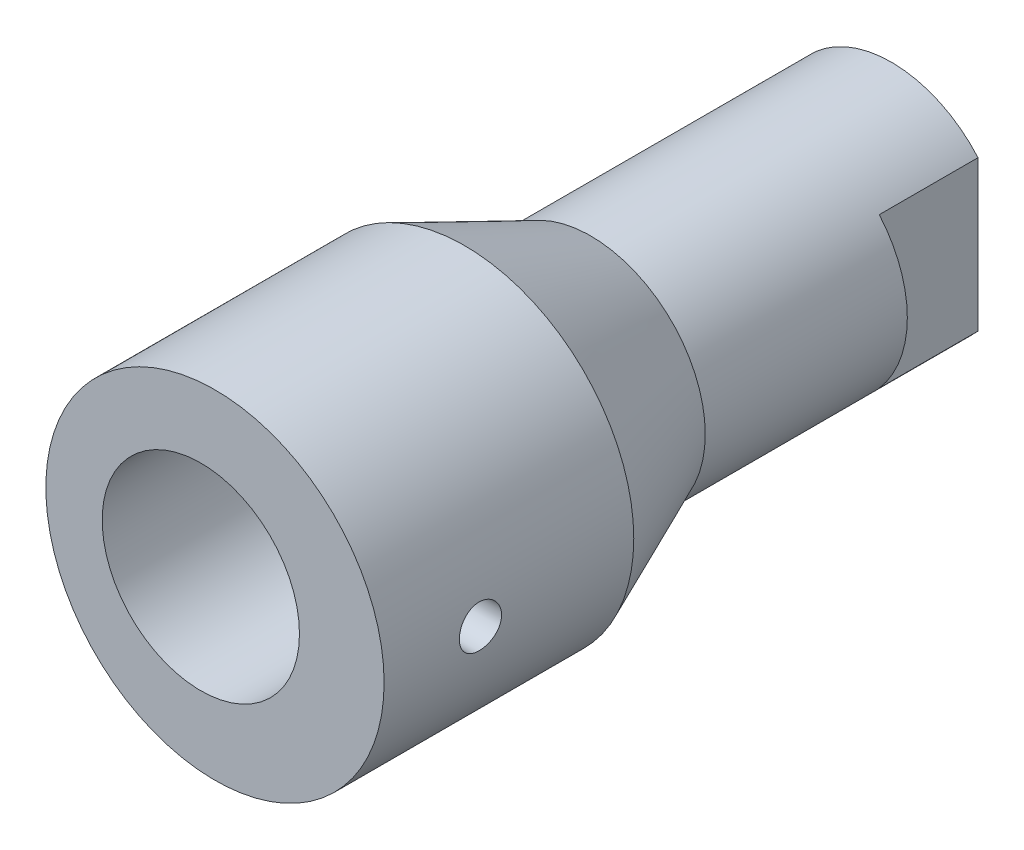
ISO-10303-21;
HEADER;
FILE_DESCRIPTION(('STEP AP214'),'2;1');
FILE_NAME('part.step','',(''),(''),'','','');
FILE_SCHEMA(('AUTOMOTIVE_DESIGN { 1 0 10303 214 1 1 1 1 }'));
ENDSEC;
DATA;
#1=APPLICATION_CONTEXT('core data for automotive mechanical design processes');
#2=APPLICATION_PROTOCOL_DEFINITION('international standard','automotive_design',2000,#1);
#3=PRODUCT_CONTEXT('',#1,'mechanical');
#4=PRODUCT('Part','Part','',(#3));
#5=PRODUCT_RELATED_PRODUCT_CATEGORY('part','',(#4));
#6=PRODUCT_DEFINITION_FORMATION('','',#4);
#7=PRODUCT_DEFINITION_CONTEXT('part definition',#1,'design');
#8=PRODUCT_DEFINITION('design','',#6,#7);
#9=PRODUCT_DEFINITION_SHAPE('','',#8);
#10=(LENGTH_UNIT() NAMED_UNIT(*) SI_UNIT(.MILLI.,.METRE.));
#11=(NAMED_UNIT(*) PLANE_ANGLE_UNIT() SI_UNIT($,.RADIAN.));
#12=(NAMED_UNIT(*) SI_UNIT($,.STERADIAN.) SOLID_ANGLE_UNIT());
#13=UNCERTAINTY_MEASURE_WITH_UNIT(LENGTH_MEASURE(1.E-05),#10,'distance_accuracy_value','');
#14=(GEOMETRIC_REPRESENTATION_CONTEXT(3) GLOBAL_UNCERTAINTY_ASSIGNED_CONTEXT((#13)) GLOBAL_UNIT_ASSIGNED_CONTEXT((#10,
#11,#12)) REPRESENTATION_CONTEXT('',''));
#15=CARTESIAN_POINT('',(0.,0.,0.));
#16=DIRECTION('',(0.,0.,1.));
#17=DIRECTION('',(1.,0.,0.));
#18=AXIS2_PLACEMENT_3D('',#15,#16,#17);
#19=CARTESIAN_POINT('',(0.,0.,16.3461290322581));
#20=DIRECTION('',(0.,0.,1.));
#21=DIRECTION('',(1.,0.,0.));
#22=AXIS2_PLACEMENT_3D('',#19,#20,#21);
#23=CYLINDRICAL_SURFACE('',#22,9.525);
#24=CARTESIAN_POINT('',(0.,0.,16.3461290322581));
#25=DIRECTION('',(0.,0.,1.));
#26=DIRECTION('',(1.,0.,0.));
#27=AXIS2_PLACEMENT_3D('',#24,#25,#26);
#28=CIRCLE('',#27,9.525);
#29=CARTESIAN_POINT('',(9.525,0.,16.3461290322581));
#30=VERTEX_POINT('',#29);
#31=EDGE_CURVE('E105',#30,#30,#28,.T.);
#32=ORIENTED_EDGE('',*,*,#31,.F.);
#33=EDGE_LOOP('',(#32));
#34=FACE_BOUND('',#33,.T.);
#35=CARTESIAN_POINT('',(0.,0.,2.28612903225807));
#36=DIRECTION('',(0.,0.,1.));
#37=DIRECTION('',(1.,0.,0.));
#38=AXIS2_PLACEMENT_3D('',#35,#36,#37);
#39=CIRCLE('',#38,9.525);
#40=CARTESIAN_POINT('',(9.525,0.,2.28612903225807));
#41=VERTEX_POINT('',#40);
#42=EDGE_CURVE('E97',#41,#41,#39,.T.);
#43=ORIENTED_EDGE('',*,*,#42,.T.);
#44=EDGE_LOOP('',(#43));
#45=FACE_BOUND('',#44,.T.);
#46=CARTESIAN_POINT('',(9.525,0.,9.72803795830738));
#47=CARTESIAN_POINT('',(9.52499907170145,0.0665646520037431,9.72804078638131));
#48=CARTESIAN_POINT('',(9.52429485853708,0.133170905648445,9.73364189763921));
#49=CARTESIAN_POINT('',(9.52155335064732,0.264530009211301,9.75589742294277));
#50=CARTESIAN_POINT('',(9.5195146637934,0.329280849845303,9.77256338014122));
#51=CARTESIAN_POINT('',(9.51433387889246,0.455008417360698,9.81644993177726));
#52=CARTESIAN_POINT('',(9.51119252345853,0.515987651873184,9.84366342405887));
#53=CARTESIAN_POINT('',(9.50415578957354,0.632502022652442,9.90785703219819));
#54=CARTESIAN_POINT('',(9.50026054056031,0.688038091007486,9.94483547188485));
#55=CARTESIAN_POINT('',(9.49212697127573,0.792406676952907,10.0277267225323));
#56=CARTESIAN_POINT('',(9.48788706067079,0.841204946929219,10.073682503049));
#57=CARTESIAN_POINT('',(9.47955485668132,0.930417788482917,10.1731316719396));
#58=CARTESIAN_POINT('',(9.47546257082798,0.970831932835929,10.2266254441889));
#59=CARTESIAN_POINT('',(9.46787329340602,1.04225683375581,10.3398546052331));
#60=CARTESIAN_POINT('',(9.4643783500292,1.07323551067544,10.3996103789618));
#61=CARTESIAN_POINT('',(9.4584004228715,1.1247052340692,10.5235271593249));
#62=CARTESIAN_POINT('',(9.4559174007561,1.14519667783775,10.587687998975));
#63=CARTESIAN_POINT('',(9.45225962798759,1.17500620795241,10.7182382293527));
#64=CARTESIAN_POINT('',(9.45107810971302,1.18438211302209,10.7846142249681));
#65=CARTESIAN_POINT('',(9.450136403881,1.19187332796745,10.9180072829718));
#66=CARTESIAN_POINT('',(9.45037615922421,1.18998909021671,10.9850243194983));
#67=CARTESIAN_POINT('',(9.45224371835326,1.1750609694632,11.117394151468));
#68=CARTESIAN_POINT('',(9.45386360029008,1.16208077520942,11.1827542571149));
#69=CARTESIAN_POINT('',(9.45829653544857,1.12542857055956,11.310361226825));
#70=CARTESIAN_POINT('',(9.46110961282181,1.10175634374461,11.372608027843));
#71=CARTESIAN_POINT('',(9.46762095589266,1.04432358022543,11.4924192940394));
#72=CARTESIAN_POINT('',(9.47132164456707,1.01053536538763,11.5499703543678));
#73=CARTESIAN_POINT('',(9.47918935918016,0.933849550190273,11.6586095877829));
#74=CARTESIAN_POINT('',(9.48335640642261,0.890951533604897,11.7096974653972));
#75=CARTESIAN_POINT('',(9.49172252818641,0.796910859530199,11.8043298060407));
#76=CARTESIAN_POINT('',(9.49592162513353,0.745713305587401,11.8478197324498));
#77=CARTESIAN_POINT('',(9.50385178207517,0.636715888465115,11.9255970223842));
#78=CARTESIAN_POINT('',(9.50758284099238,0.578916010089009,11.9598843647272));
#79=CARTESIAN_POINT('',(9.51415884469546,0.458312624526359,12.0182832305622));
#80=CARTESIAN_POINT('',(9.51700349218751,0.395507447460569,12.0423913409985));
#81=CARTESIAN_POINT('',(9.52148345761662,0.266696949285937,12.0797041155535));
#82=CARTESIAN_POINT('',(9.5231188321096,0.200691777989969,12.09290928959));
#83=CARTESIAN_POINT('',(9.5249886368126,0.0678264889648327,12.1079706651379));
#84=CARTESIAN_POINT('',(9.5252323407042,0.000975012917947294,12.1099019941432));
#85=CARTESIAN_POINT('',(9.52431638332426,-0.132098660203066,12.1025591162331));
#86=CARTESIAN_POINT('',(9.52315675190681,-0.198320870633774,12.0932851476955));
#87=CARTESIAN_POINT('',(9.51957020630124,-0.32803454383064,12.0638573391096));
#88=CARTESIAN_POINT('',(9.51714746524507,-0.391534258151819,12.043739318871));
#89=CARTESIAN_POINT('',(9.51130594946059,-0.51425856889069,11.9932317234835));
#90=CARTESIAN_POINT('',(9.50788714094501,-0.573483020203593,11.9628417998992));
#91=CARTESIAN_POINT('',(9.50041153946152,-0.686311172020218,11.8924712771789));
#92=CARTESIAN_POINT('',(9.49635155070484,-0.739884346150236,11.8524420790868));
#93=CARTESIAN_POINT('',(9.48805775592256,-0.839578626205299,11.7639980471728));
#94=CARTESIAN_POINT('',(9.48382394301005,-0.885699436509324,11.7155828808532));
#95=CARTESIAN_POINT('',(9.47563106843556,-0.969446321520713,11.6114103226808));
#96=CARTESIAN_POINT('',(9.47167370611486,-1.00702259779219,11.5556127435138));
#97=CARTESIAN_POINT('',(9.46450973694477,-1.07226973749048,11.438454271705));
#98=CARTESIAN_POINT('',(9.46130311505912,-1.09994079931048,11.3770934905205));
#99=CARTESIAN_POINT('',(9.45601525451816,-1.14451140309528,11.2507111315565));
#100=CARTESIAN_POINT('',(9.45393108416766,-1.161439026368,11.1856995849601));
#101=CARTESIAN_POINT('',(9.45111568721878,-1.18413266957875,11.0537290547347));
#102=CARTESIAN_POINT('',(9.4503843977522,-1.18989920817153,10.9867701617456));
#103=CARTESIAN_POINT('',(9.45035939069785,-1.19009748271758,10.853301089487));
#104=CARTESIAN_POINT('',(9.45105575057478,-1.18460745471799,10.7867910147421));
#105=CARTESIAN_POINT('',(9.45378624695124,-1.16261410620535,10.6556468143641));
#106=CARTESIAN_POINT('',(9.45582038359876,-1.14611078447389,10.5910126889385));
#107=CARTESIAN_POINT('',(9.46099416880242,-1.10258376851857,10.4654653776988));
#108=CARTESIAN_POINT('',(9.46413342179665,-1.07556383821178,10.4045508696392));
#109=CARTESIAN_POINT('',(9.47116437846166,-1.01177830478418,10.2881078973395));
#110=CARTESIAN_POINT('',(9.47505609152141,-0.975012580056269,10.2325795003187));
#111=CARTESIAN_POINT('',(9.48318587427232,-0.89248884651042,10.1280850775325));
#112=CARTESIAN_POINT('',(9.48742607972733,-0.846672532268642,10.0791652610174));
#113=CARTESIAN_POINT('',(9.49575622588527,-0.747469729091237,9.9896782287403));
#114=CARTESIAN_POINT('',(9.49984613092141,-0.694081457725055,9.94911298516487));
#115=CARTESIAN_POINT('',(9.50743200612474,-0.581017694542081,9.87735545046941));
#116=CARTESIAN_POINT('',(9.51092566093731,-0.521319088388247,9.84619935216814));
#117=CARTESIAN_POINT('',(9.51690191028703,-0.397526902560449,9.79439892607394));
#118=CARTESIAN_POINT('',(9.51938560294232,-0.333438185297214,9.77374317524818));
#119=CARTESIAN_POINT('',(9.52246331056611,-0.224181596016582,9.74847455928046));
#120=CARTESIAN_POINT('',(9.52340993512496,-0.179702687213667,9.74082184731768));
#121=CARTESIAN_POINT('',(9.52467859193208,-0.0901555449611947,9.73060260776452));
#122=CARTESIAN_POINT('',(9.52500062877952,-0.0450873158535712,9.72803604272217));
#123=CARTESIAN_POINT('',(9.525,0.,9.72803795830738));
#124=B_SPLINE_CURVE_WITH_KNOTS('',3,(#46,#47,#48,#49,#50,#51,#52,#53,#54,#55,#56,#57,#58,#59,
#60,#61,#62,#63,#64,#65,#66,#67,#68,#69,#70,#71,#72,#73,#74,#75,#76,#77,#78,#79,#80,#81,#82,#83,
#84,#85,#86,#87,#88,#89,#90,#91,#92,#93,#94,#95,#96,#97,#98,#99,#100,#101,#102,#103,#104,#105,
#106,#107,#108,#109,#110,#111,#112,#113,#114,#115,#116,#117,#118,#119,#120,#121,#122,#123),
.UNSPECIFIED.,.T.,.F.,(4,2,2,2,2,2,2,2,2,2,2,2,2,2,2,2,2,2,2,2,2,2,2,2,2,2,2,2,2,2,2,2,2,2,2,2,
2,2,4),(0.,0.199529266287023,0.399267014778791,0.598870503365467,0.798439751894954,
0.998988728802717,1.199547922444,1.40078157549877,1.60200760452837,1.80218227602547,
2.0023489056066,2.20137427117681,2.4004036654268,2.59998267510015,2.79957080547855,
3.00053741906827,3.20150449523365,3.40253890144869,3.60356390498639,3.80324775993076,
4.0029273669426,4.20195140325147,4.40098219137312,4.60103826680341,4.80110227612839,
5.0023039881803,5.20350167010428,5.40417126985321,5.60483154427725,5.80410190618668,
6.00337229014164,6.20257142027768,6.40177303611889,6.60230244941591,6.80287914571096,
7.00421782289996,7.2053369981424,7.34048838893393,7.47563878453141),.UNSPECIFIED.);
#125=CARTESIAN_POINT('',(9.525,0.,9.72803795830738));
#126=VERTEX_POINT('',#125);
#127=EDGE_CURVE('E145',#126,#126,#124,.T.);
#128=ORIENTED_EDGE('',*,*,#127,.F.);
#129=EDGE_LOOP('',(#128));
#130=FACE_BOUND('',#129,.T.);
#131=ADVANCED_FACE('F45',(#34,#45,#130),#23,.T.);
#132=CARTESIAN_POINT('',(-0.796682273705366,0.,2.28612903225807));
#133=DIRECTION('',(0.,0.,1.));
#134=DIRECTION('',(1.,0.,0.));
#135=AXIS2_PLACEMENT_3D('',#132,#133,#134);
#136=CYLINDRICAL_SURFACE('',#135,5.555);
#137=CARTESIAN_POINT('',(-0.796682273705366,0.,2.28612903225807));
#138=DIRECTION('',(0.,0.,1.));
#139=DIRECTION('',(1.,0.,0.));
#140=AXIS2_PLACEMENT_3D('',#137,#138,#139);
#141=CIRCLE('',#140,5.555);
#142=CARTESIAN_POINT('',(4.75831772629463,0.,2.28612903225807));
#143=VERTEX_POINT('',#142);
#144=EDGE_CURVE('E87',#143,#143,#141,.T.);
#145=ORIENTED_EDGE('',*,*,#144,.F.);
#146=EDGE_LOOP('',(#145));
#147=FACE_BOUND('',#146,.T.);
#148=CARTESIAN_POINT('',(-0.796682273705366,0.,16.3461290322581));
#149=DIRECTION('',(0.,0.,1.));
#150=DIRECTION('',(1.,0.,0.));
#151=AXIS2_PLACEMENT_3D('',#148,#149,#150);
#152=CIRCLE('',#151,5.555);
#153=CARTESIAN_POINT('',(4.75831772629463,0.,16.3461290322581));
#154=VERTEX_POINT('',#153);
#155=EDGE_CURVE('E111',#154,#154,#152,.T.);
#156=ORIENTED_EDGE('',*,*,#155,.T.);
#157=EDGE_LOOP('',(#156));
#158=FACE_BOUND('',#157,.T.);
#159=CARTESIAN_POINT('',(4.75831772629463,0.,9.72803795830738));
#160=CARTESIAN_POINT('',(4.75831650486393,-0.0660342800705412,9.72804025928893));
#161=CARTESIAN_POINT('',(4.75712827152386,-0.132096675101162,9.73355298071987));
#162=CARTESIAN_POINT('',(4.75250290288166,-0.262347256952575,9.7554366587914));
#163=CARTESIAN_POINT('',(4.74906411600066,-0.326534031175286,9.77181558976989));
#164=CARTESIAN_POINT('',(4.74032079791459,-0.451131949785501,9.81489694406354));
#165=CARTESIAN_POINT('',(4.73501817622749,-0.511546884142301,9.84158880444293));
#166=CARTESIAN_POINT('',(4.72312051564755,-0.6270382694104,9.90450533042642));
#167=CARTESIAN_POINT('',(4.71652552089319,-0.682114902544965,9.94072967048178));
#168=CARTESIAN_POINT('',(4.70265266188753,-0.78621858887305,10.022274551063));
#169=CARTESIAN_POINT('',(4.69536661724108,-0.835151476315312,10.0677139266966));
#170=CARTESIAN_POINT('',(4.6809909409917,-0.92476242152041,10.1661438174174));
#171=CARTESIAN_POINT('',(4.67390132638573,-0.965439766850931,10.2191349835337));
#172=CARTESIAN_POINT('',(4.66064076927902,-1.03779677708058,10.3318557902009));
#173=CARTESIAN_POINT('',(4.65448032018367,-1.06937687527162,10.3916506884289));
#174=CARTESIAN_POINT('',(4.64389272367398,-1.12200448105653,10.5158522631228));
#175=CARTESIAN_POINT('',(4.63946537807425,-1.14305319302135,10.580258411282));
#176=CARTESIAN_POINT('',(4.63292845228886,-1.17371068307904,10.7108347844955));
#177=CARTESIAN_POINT('',(4.63078520454825,-1.18348581582231,10.7769642307153));
#178=CARTESIAN_POINT('',(4.62895797234865,-1.1918357922015,10.9099565361315));
#179=CARTESIAN_POINT('',(4.62927369833951,-1.19041195454324,10.9768193080511));
#180=CARTESIAN_POINT('',(4.63229823287153,-1.17653843553382,11.1081484746449));
#181=CARTESIAN_POINT('',(4.63496523416709,-1.16428136673547,11.172636324934));
#182=CARTESIAN_POINT('',(4.64232578383026,-1.12939419578288,11.2986186325698));
#183=CARTESIAN_POINT('',(4.64701944172427,-1.1067635330055,11.3601129279364));
#184=CARTESIAN_POINT('',(4.65794602847259,-1.05159297376499,11.4789073776276));
#185=CARTESIAN_POINT('',(4.66419048038265,-1.018978450629,11.536171769861));
#186=CARTESIAN_POINT('',(4.67750791486823,-0.944818494318867,11.6444864459542));
#187=CARTESIAN_POINT('',(4.68458100595603,-0.903271890871408,11.6955359141661));
#188=CARTESIAN_POINT('',(4.69893857268775,-0.811404635046038,11.791081195813));
#189=CARTESIAN_POINT('',(4.70622439187757,-0.760920044060924,11.8354193292742));
#190=CARTESIAN_POINT('',(4.7200528643354,-0.653150152505892,11.9150247544346));
#191=CARTESIAN_POINT('',(4.72659550518382,-0.595864738317044,11.9502918945569));
#192=CARTESIAN_POINT('',(4.73822033729145,-0.475931166127915,12.010790740517));
#193=CARTESIAN_POINT('',(4.74329961160417,-0.41327261583619,12.0360024406271));
#194=CARTESIAN_POINT('',(4.75140363262856,-0.284475655442309,12.0754959313442));
#195=CARTESIAN_POINT('',(4.75442866565228,-0.218337731666589,12.0897792451418));
#196=CARTESIAN_POINT('',(4.75804283015492,-0.0858125781112806,12.1067826871964));
#197=CARTESIAN_POINT('',(4.75867735064346,-0.0194541982128978,12.1097183042088));
#198=CARTESIAN_POINT('',(4.75756591090005,0.112804780965925,12.1045261658874));
#199=CARTESIAN_POINT('',(4.75582010521037,0.178705409686591,12.0963991287948));
#200=CARTESIAN_POINT('',(4.75017275822353,0.307468893186604,12.0694911592989));
#201=CARTESIAN_POINT('',(4.74629397448364,0.370356326067018,12.0508226424901));
#202=CARTESIAN_POINT('',(4.73681457021992,0.49210749402381,12.0034859398284));
#203=CARTESIAN_POINT('',(4.73121380719711,0.550970895606491,11.9748169263777));
#204=CARTESIAN_POINT('',(4.71879943126054,0.663898555914964,11.9078398039828));
#205=CARTESIAN_POINT('',(4.71197016983667,0.717885511292983,11.8694043209222));
#206=CARTESIAN_POINT('',(4.69788941422516,0.818720721554914,11.7841537236455));
#207=CARTESIAN_POINT('',(4.6906378676654,0.865568088364432,11.7373375685525));
#208=CARTESIAN_POINT('',(4.67637398996238,0.951641255105383,11.6356676008877));
#209=CARTESIAN_POINT('',(4.6693681291153,0.990718144125873,11.5806866482478));
#210=CARTESIAN_POINT('',(4.65653523633522,1.05908385859741,11.4648154751661));
#211=CARTESIAN_POINT('',(4.65070815416636,1.08837310120201,11.4039255067119));
#212=CARTESIAN_POINT('',(4.64094672524834,1.13613854198992,11.27828757356));
#213=CARTESIAN_POINT('',(4.63700193181648,1.15467454741873,11.2135631979523));
#214=CARTESIAN_POINT('',(4.63143201085986,1.1805842337897,11.0818235341782));
#215=CARTESIAN_POINT('',(4.62980652971027,1.18795961639902,11.0148085968487));
#216=CARTESIAN_POINT('',(4.62908091024495,1.19126858612439,10.8818899050614));
#217=CARTESIAN_POINT('',(4.62992870636984,1.1874380666431,10.8159921968709));
#218=CARTESIAN_POINT('',(4.63393671854361,1.16896965273803,10.6858044053278));
#219=CARTESIAN_POINT('',(4.63709690960985,1.15433187507362,10.6215143046148));
#220=CARTESIAN_POINT('',(4.64534877044085,1.11477630319893,10.4965448200675));
#221=CARTESIAN_POINT('',(4.65043423698942,1.08989150243942,10.4358545564604));
#222=CARTESIAN_POINT('',(4.66196633312152,1.03057712630002,10.3194749538443));
#223=CARTESIAN_POINT('',(4.66841309778119,0.996146603630325,10.2637861118885));
#224=CARTESIAN_POINT('',(4.68209787317795,0.917929949678161,10.1578243409381));
#225=CARTESIAN_POINT('',(4.68934881715121,0.873975139020828,10.1076775709029));
#226=CARTESIAN_POINT('',(4.70373661795815,0.778301102847118,10.0153941948835));
#227=CARTESIAN_POINT('',(4.71087344808733,0.726580088506841,9.97325943942272));
#228=CARTESIAN_POINT('',(4.7243331541141,0.616073545931477,9.89770022085137));
#229=CARTESIAN_POINT('',(4.73064490597203,0.557208757905837,9.86438959068941));
#230=CARTESIAN_POINT('',(4.7416322763302,0.434594214369691,9.80818756812529));
#231=CARTESIAN_POINT('',(4.74630929188597,0.370848687052075,9.78528727393032));
#232=CARTESIAN_POINT('',(4.75264717599416,0.255849119939279,9.75472581044275));
#233=CARTESIAN_POINT('',(4.75476064379962,0.205225728935321,9.74473664465069));
#234=CARTESIAN_POINT('',(4.75759636716679,0.103073910812623,9.73139195641828));
#235=CARTESIAN_POINT('',(4.75831867972794,0.0515455208614685,9.72803616219039));
#236=CARTESIAN_POINT('',(4.75831772629463,0.,9.72803795830738));
#237=B_SPLINE_CURVE_WITH_KNOTS('',3,(#159,#160,#161,#162,#163,#164,#165,#166,#167,#168,#169,
#170,#171,#172,#173,#174,#175,#176,#177,#178,#179,#180,#181,#182,#183,#184,#185,#186,#187,#188,
#189,#190,#191,#192,#193,#194,#195,#196,#197,#198,#199,#200,#201,#202,#203,#204,#205,#206,#207,
#208,#209,#210,#211,#212,#213,#214,#215,#216,#217,#218,#219,#220,#221,#222,#223,#224,#225,#226,
#227,#228,#229,#230,#231,#232,#233,#234,#235,#236),.UNSPECIFIED.,.T.,.F.,(4,2,2,2,2,2,2,2,2,2,2,
2,2,2,2,2,2,2,2,2,2,2,2,2,2,2,2,2,2,2,2,2,2,2,2,2,2,2,4),(0.,0.197914190240527,
0.395973783807957,0.593831051897984,0.791681563736709,0.992267449754004,1.19287063847021,
1.39559250468859,1.59829118230134,1.79795891320242,1.99760313309788,2.19376756274178,
2.38994259500686,2.58762134989339,2.78532602027766,2.98712648763861,3.18893032688263,
3.39113368430732,3.59330885363726,3.79162536537782,3.98992900206443,4.186156795083,
4.38240083091677,4.58134891648098,4.78032172850496,4.98280203927104,5.18527371914142,
5.38660822236875,5.58791202490385,5.78500891214147,5.98210367001646,6.17856872201266,
6.37505327761459,6.57535303544163,6.77569900016674,6.97851583362647,7.181158912346,
7.3356545474013,7.49014385221277),.UNSPECIFIED.);
#238=CARTESIAN_POINT('',(4.75831772629463,0.,9.72803795830738));
#239=VERTEX_POINT('',#238);
#240=EDGE_CURVE('E49',#239,#239,#237,.T.);
#241=ORIENTED_EDGE('',*,*,#240,.F.);
#242=EDGE_LOOP('',(#241));
#243=FACE_BOUND('',#242,.T.);
#244=ADVANCED_FACE('F132',(#147,#158,#243),#136,.F.);
#245=CARTESIAN_POINT('',(0.,9.525,16.3461290322581));
#246=DIRECTION('',(0.,0.,-1.));
#247=DIRECTION('',(-1.,0.,0.));
#248=AXIS2_PLACEMENT_3D('',#245,#246,#247);
#249=PLANE('',#248);
#250=ORIENTED_EDGE('',*,*,#155,.F.);
#251=EDGE_LOOP('',(#250));
#252=FACE_BOUND('',#251,.T.);
#253=ORIENTED_EDGE('',*,*,#31,.T.);
#254=EDGE_LOOP('',(#253));
#255=FACE_BOUND('',#254,.T.);
#256=ADVANCED_FACE('F47',(#252,#255),#249,.F.);
#257=CARTESIAN_POINT('',(0.,0.,-21.7538709677419));
#258=DIRECTION('',(0.,0.,1.));
#259=DIRECTION('',(1.,0.,0.));
#260=AXIS2_PLACEMENT_3D('',#257,#258,#259);
#261=PLANE('',#260);
#262=CARTESIAN_POINT('',(0.,0.,-21.7538709677419));
#263=DIRECTION('',(0.,0.,1.));
#264=DIRECTION('',(1.,0.,0.));
#265=AXIS2_PLACEMENT_3D('',#262,#263,#264);
#266=CIRCLE('',#265,6.45);
#267=CARTESIAN_POINT('',(4.87,4.22913702781076,-21.7538709677419));
#268=VERTEX_POINT('',#267);
#269=CARTESIAN_POINT('',(4.87,-4.22913702781076,-21.7538709677419));
#270=VERTEX_POINT('',#269);
#271=EDGE_CURVE('E85',#268,#270,#266,.T.);
#272=ORIENTED_EDGE('',*,*,#271,.F.);
#273=DIRECTION('',(0.,1.,0.));
#274=VECTOR('',#273,1.);
#275=CARTESIAN_POINT('',(4.87,-5.,-21.7538709677419));
#276=LINE('',#275,#274);
#277=EDGE_CURVE('E67',#270,#268,#276,.T.);
#278=ORIENTED_EDGE('',*,*,#277,.F.);
#279=EDGE_LOOP('',(#272,#278));
#280=FACE_BOUND('',#279,.T.);
#281=ADVANCED_FACE('F84',(#280),#261,.F.);
#282=CARTESIAN_POINT('',(0.,0.,16.3461290322581));
#283=DIRECTION('',(0.,0.,1.));
#284=DIRECTION('',(1.,0.,0.));
#285=AXIS2_PLACEMENT_3D('',#282,#283,#284);
#286=CYLINDRICAL_SURFACE('',#285,6.45);
#287=CARTESIAN_POINT('',(0.,0.,-4.81387096774193));
#288=DIRECTION('',(0.,0.,1.));
#289=DIRECTION('',(1.,0.,0.));
#290=AXIS2_PLACEMENT_3D('',#287,#288,#289);
#291=CIRCLE('',#290,6.45);
#292=CARTESIAN_POINT('',(6.45,0.,-4.81387096774193));
#293=VERTEX_POINT('',#292);
#294=EDGE_CURVE('E91',#293,#293,#291,.T.);
#295=ORIENTED_EDGE('',*,*,#294,.F.);
#296=EDGE_LOOP('',(#295));
#297=FACE_BOUND('',#296,.T.);
#298=DIRECTION('',(0.,0.,1.));
#299=VECTOR('',#298,1.);
#300=CARTESIAN_POINT('',(4.87000000000001,-4.22913702781075,16.3461290322581));
#301=LINE('',#300,#299);
#302=CARTESIAN_POINT('',(4.87,-4.22913702781075,-16.1938709677419));
#303=VERTEX_POINT('',#302);
#304=EDGE_CURVE('E11',#270,#303,#301,.T.);
#305=ORIENTED_EDGE('',*,*,#304,.T.);
#306=CARTESIAN_POINT('',(0.,0.,-16.1938709677419));
#307=DIRECTION('',(0.,0.,1.));
#308=DIRECTION('',(1.,0.,0.));
#309=AXIS2_PLACEMENT_3D('',#306,#307,#308);
#310=CIRCLE('',#309,6.45);
#311=CARTESIAN_POINT('',(4.87,4.22913702781075,-16.1938709677419));
#312=VERTEX_POINT('',#311);
#313=EDGE_CURVE('E60',#303,#312,#310,.T.);
#314=ORIENTED_EDGE('',*,*,#313,.T.);
#315=DIRECTION('',(0.,0.,1.));
#316=VECTOR('',#315,1.);
#317=CARTESIAN_POINT('',(4.87000000000001,4.22913702781075,16.3461290322581));
#318=LINE('',#317,#316);
#319=EDGE_CURVE('E71',#312,#268,#318,.F.);
#320=ORIENTED_EDGE('',*,*,#319,.T.);
#321=ORIENTED_EDGE('',*,*,#271,.T.);
#322=EDGE_LOOP('',(#305,#314,#320,#321));
#323=FACE_BOUND('',#322,.T.);
#324=ADVANCED_FACE('F89',(#297,#323),#286,.T.);
#325=CARTESIAN_POINT('',(0.,0.,-4.81387096774193));
#326=DIRECTION('',(0.,0.,1.));
#327=DIRECTION('',(1.,0.,0.));
#328=AXIS2_PLACEMENT_3D('',#325,#326,#327);
#329=CONICAL_SURFACE('',#328,6.45,0.408710180964567);
#330=ORIENTED_EDGE('',*,*,#42,.F.);
#331=EDGE_LOOP('',(#330));
#332=FACE_BOUND('',#331,.T.);
#333=ORIENTED_EDGE('',*,*,#294,.T.);
#334=EDGE_LOOP('',(#333));
#335=FACE_BOUND('',#334,.T.);
#336=ADVANCED_FACE('F119',(#332,#335),#329,.T.);
#337=CARTESIAN_POINT('',(6.45,-5.,-16.1938709677419));
#338=DIRECTION('',(0.,0.,1.));
#339=DIRECTION('',(1.,0.,0.));
#340=AXIS2_PLACEMENT_3D('',#337,#338,#339);
#341=PLANE('',#340);
#342=ORIENTED_EDGE('',*,*,#313,.F.);
#343=DIRECTION('',(0.,1.,0.));
#344=VECTOR('',#343,1.);
#345=CARTESIAN_POINT('',(4.87,-5.,-16.1938709677419));
#346=LINE('',#345,#344);
#347=EDGE_CURVE('E78',#303,#312,#346,.T.);
#348=ORIENTED_EDGE('',*,*,#347,.T.);
#349=EDGE_LOOP('',(#342,#348));
#350=FACE_BOUND('',#349,.T.);
#351=ADVANCED_FACE('F103',(#350),#341,.F.);
#352=CARTESIAN_POINT('',(4.87,-5.,-21.7538709677419));
#353=DIRECTION('',(-1.,0.,0.));
#354=DIRECTION('',(0.,0.,1.));
#355=AXIS2_PLACEMENT_3D('',#352,#353,#354);
#356=PLANE('',#355);
#357=ORIENTED_EDGE('',*,*,#277,.T.);
#358=ORIENTED_EDGE('',*,*,#319,.F.);
#359=ORIENTED_EDGE('',*,*,#347,.F.);
#360=ORIENTED_EDGE('',*,*,#304,.F.);
#361=EDGE_LOOP('',(#357,#358,#359,#360));
#362=FACE_BOUND('',#361,.T.);
#363=ADVANCED_FACE('F77',(#362),#356,.F.);
#364=CARTESIAN_POINT('',(-0.796682273705366,0.,2.28612903225807));
#365=DIRECTION('',(0.,0.,1.));
#366=DIRECTION('',(1.,0.,0.));
#367=AXIS2_PLACEMENT_3D('',#364,#365,#366);
#368=PLANE('',#367);
#369=ORIENTED_EDGE('',*,*,#144,.T.);
#370=EDGE_LOOP('',(#369));
#371=FACE_BOUND('',#370,.T.);
#372=ADVANCED_FACE('F155',(#371),#368,.T.);
#373=CARTESIAN_POINT('',(14.06,0.,10.9180379583074));
#374=DIRECTION('',(-1.,0.,0.));
#375=DIRECTION('',(0.,0.,1.));
#376=AXIS2_PLACEMENT_3D('',#373,#374,#375);
#377=CYLINDRICAL_SURFACE('',#376,1.19);
#378=ORIENTED_EDGE('',*,*,#240,.T.);
#379=EDGE_LOOP('',(#378));
#380=FACE_BOUND('',#379,.T.);
#381=ORIENTED_EDGE('',*,*,#127,.T.);
#382=EDGE_LOOP('',(#381));
#383=FACE_BOUND('',#382,.T.);
#384=ADVANCED_FACE('F151',(#380,#383),#377,.F.);
#385=CLOSED_SHELL('',(#131,#244,#256,#281,#324,#336,#351,#363,#372,#384));
#386=MANIFOLD_SOLID_BREP('B2',#385);
#387=ADVANCED_BREP_SHAPE_REPRESENTATION('',(#18,#386),#14);
#388=SHAPE_DEFINITION_REPRESENTATION(#9,#387);
ENDSEC;
END-ISO-10303-21;
